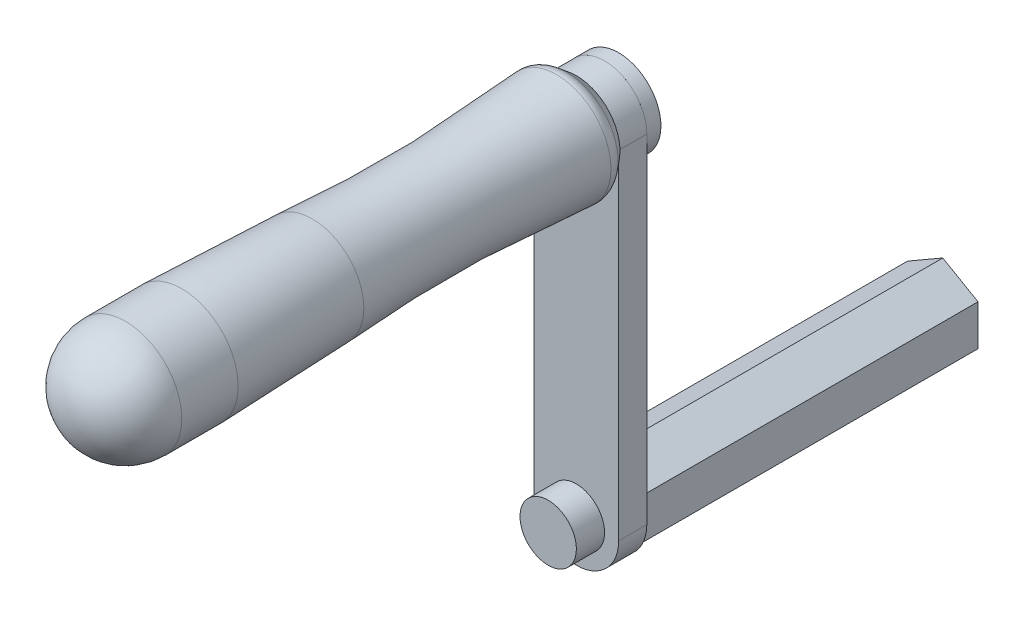
ISO-10303-21;
HEADER;
FILE_DESCRIPTION(('STEP AP214'),'2;1');
FILE_NAME('part.step','',(''),(''),'','','');
FILE_SCHEMA(('AUTOMOTIVE_DESIGN { 1 0 10303 214 1 1 1 1 }'));
ENDSEC;
DATA;
#1=APPLICATION_CONTEXT('core data for automotive mechanical design processes');
#2=APPLICATION_PROTOCOL_DEFINITION('international standard','automotive_design',2000,#1);
#3=PRODUCT_CONTEXT('',#1,'mechanical');
#4=PRODUCT('Part','Part','',(#3));
#5=PRODUCT_RELATED_PRODUCT_CATEGORY('part','',(#4));
#6=PRODUCT_DEFINITION_FORMATION('','',#4);
#7=PRODUCT_DEFINITION_CONTEXT('part definition',#1,'design');
#8=PRODUCT_DEFINITION('design','',#6,#7);
#9=PRODUCT_DEFINITION_SHAPE('','',#8);
#10=(LENGTH_UNIT() NAMED_UNIT(*) SI_UNIT(.MILLI.,.METRE.));
#11=(NAMED_UNIT(*) PLANE_ANGLE_UNIT() SI_UNIT($,.RADIAN.));
#12=(NAMED_UNIT(*) SI_UNIT($,.STERADIAN.) SOLID_ANGLE_UNIT());
#13=UNCERTAINTY_MEASURE_WITH_UNIT(LENGTH_MEASURE(1.E-05),#10,'distance_accuracy_value','');
#14=(GEOMETRIC_REPRESENTATION_CONTEXT(3) GLOBAL_UNCERTAINTY_ASSIGNED_CONTEXT((#13)) GLOBAL_UNIT_ASSIGNED_CONTEXT((#10,
#11,#12)) REPRESENTATION_CONTEXT('',''));
#15=CARTESIAN_POINT('',(0.,0.,0.));
#16=DIRECTION('',(0.,0.,1.));
#17=DIRECTION('',(1.,0.,0.));
#18=AXIS2_PLACEMENT_3D('',#15,#16,#17);
#19=CARTESIAN_POINT('',(-6.66133814775094E-13,76.2000000000005,34.925));
#20=DIRECTION('',(0.,0.,-1.));
#21=DIRECTION('',(0.,1.,0.));
#22=AXIS2_PLACEMENT_3D('',#19,#20,#21);
#23=CYLINDRICAL_SURFACE('',#22,3.175);
#24=CARTESIAN_POINT('',(-6.66133814775094E-13,76.2000000000005,44.45));
#25=DIRECTION('',(0.,0.,-1.));
#26=DIRECTION('',(0.,1.,0.));
#27=AXIS2_PLACEMENT_3D('',#24,#25,#26);
#28=CIRCLE('',#27,3.175);
#29=CARTESIAN_POINT('',(-6.66133814775094E-13,79.3750000000005,44.45));
#30=VERTEX_POINT('',#29);
#31=EDGE_CURVE('E73',#30,#30,#28,.T.);
#32=ORIENTED_EDGE('',*,*,#31,.T.);
#33=EDGE_LOOP('',(#32));
#34=FACE_BOUND('',#33,.T.);
#35=CARTESIAN_POINT('',(-6.66133814775094E-13,76.2000000000005,38.1));
#36=DIRECTION('',(0.,0.,-1.));
#37=DIRECTION('',(0.,1.,0.));
#38=AXIS2_PLACEMENT_3D('',#35,#36,#37);
#39=CIRCLE('',#38,3.175);
#40=CARTESIAN_POINT('',(-6.66133814775094E-13,79.3750000000005,38.1));
#41=VERTEX_POINT('',#40);
#42=EDGE_CURVE('E99',#41,#41,#39,.T.);
#43=ORIENTED_EDGE('',*,*,#42,.F.);
#44=EDGE_LOOP('',(#43));
#45=FACE_BOUND('',#44,.T.);
#46=ADVANCED_FACE('F53',(#34,#45),#23,.T.);
#47=CARTESIAN_POINT('',(-6.66133814775094E-13,88.9000000000006,44.4500000000001));
#48=DIRECTION('',(0.,0.,-1.));
#49=DIRECTION('',(0.,1.,0.));
#50=AXIS2_PLACEMENT_3D('',#47,#48,#49);
#51=PLANE('',#50);
#52=CARTESIAN_POINT('',(-6.66133814775094E-13,76.2000000000005,44.4500000000001));
#53=DIRECTION('',(0.,0.,-1.));
#54=DIRECTION('',(0.,1.,0.));
#55=AXIS2_PLACEMENT_3D('',#52,#53,#54);
#56=CIRCLE('',#55,9.81907710263147);
#57=CARTESIAN_POINT('',(-6.66133814775094E-13,86.019077102632,44.4500000000001));
#58=VERTEX_POINT('',#57);
#59=EDGE_CURVE('E67',#58,#58,#56,.T.);
#60=ORIENTED_EDGE('',*,*,#59,.T.);
#61=EDGE_LOOP('',(#60));
#62=FACE_BOUND('',#61,.T.);
#63=ORIENTED_EDGE('',*,*,#31,.F.);
#64=EDGE_LOOP('',(#63));
#65=FACE_BOUND('',#64,.T.);
#66=ADVANCED_FACE('F109',(#62,#65),#51,.T.);
#67=CARTESIAN_POINT('',(-6.66133814775094E-13,76.2000000000005,80.0843738322252));
#68=DIRECTION('',(0.,0.,-1.));
#69=DIRECTION('',(0.,1.,0.));
#70=AXIS2_PLACEMENT_3D('',#67,#68,#69);
#71=TOROIDAL_SURFACE('',#70,340.971581775799,330.2);
#72=CARTESIAN_POINT('',(-6.66133814775094E-13,76.2000000000005,48.9048527456207));
#73=DIRECTION('',(0.,0.,1.));
#74=DIRECTION('',(0.,-1.,0.));
#75=AXIS2_PLACEMENT_3D('',#72,#73,#74);
#76=CIRCLE('',#75,12.2469592346667);
#77=CARTESIAN_POINT('',(-6.66133814775094E-13,63.9530407653337,48.9048527456207));
#78=VERTEX_POINT('',#77);
#79=EDGE_CURVE('E61',#78,#78,#76,.T.);
#80=ORIENTED_EDGE('',*,*,#79,.T.);
#81=EDGE_LOOP('',(#80));
#82=FACE_BOUND('',#81,.T.);
#83=CARTESIAN_POINT('',(-6.66133814775094E-13,76.2000000000005,103.962068321228));
#84=DIRECTION('',(0.,0.,-1.));
#85=DIRECTION('',(0.,1.,0.));
#86=AXIS2_PLACEMENT_3D('',#83,#84,#85);
#87=CIRCLE('',#86,11.6360451176823);
#88=CARTESIAN_POINT('',(-6.66133814775094E-13,87.8360451176828,103.962068321228));
#89=VERTEX_POINT('',#88);
#90=EDGE_CURVE('E79',#89,#89,#87,.T.);
#91=ORIENTED_EDGE('',*,*,#90,.T.);
#92=EDGE_LOOP('',(#91));
#93=FACE_BOUND('',#92,.T.);
#94=ADVANCED_FACE('F116',(#82,#93),#71,.F.);
#95=CARTESIAN_POINT('',(-6.66133814775094E-13,76.2000000000005,133.35));
#96=DIRECTION('',(0.,0.,-1.));
#97=DIRECTION('',(0.,1.,0.));
#98=AXIS2_PLACEMENT_3D('',#95,#96,#97);
#99=DEGENERATE_TOROIDAL_SURFACE('',#98,393.7,406.4,.F.);
#100=CARTESIAN_POINT('',(-6.66133814775094E-13,76.2000000000005,133.35));
#101=DIRECTION('',(0.,0.,-1.));
#102=DIRECTION('',(0.,1.,0.));
#103=AXIS2_PLACEMENT_3D('',#100,#101,#102);
#104=CIRCLE('',#103,12.7);
#105=CARTESIAN_POINT('',(-6.66133814775094E-13,88.9000000000005,133.35));
#106=VERTEX_POINT('',#105);
#107=EDGE_CURVE('E83',#106,#106,#104,.T.);
#108=ORIENTED_EDGE('',*,*,#107,.T.);
#109=EDGE_LOOP('',(#108));
#110=FACE_BOUND('',#109,.T.);
#111=ORIENTED_EDGE('',*,*,#90,.F.);
#112=EDGE_LOOP('',(#111));
#113=FACE_BOUND('',#112,.T.);
#114=ADVANCED_FACE('F155',(#110,#113),#99,.F.);
#115=CARTESIAN_POINT('',(-6.66133814775094E-13,76.2000000000005,34.925));
#116=DIRECTION('',(0.,0.,-1.));
#117=DIRECTION('',(0.,1.,0.));
#118=AXIS2_PLACEMENT_3D('',#115,#116,#117);
#119=CYLINDRICAL_SURFACE('',#118,12.7);
#120=CARTESIAN_POINT('',(-6.66133814775094E-13,76.2000000000005,146.05));
#121=DIRECTION('',(0.,0.,-1.));
#122=DIRECTION('',(0.,1.,0.));
#123=AXIS2_PLACEMENT_3D('',#120,#121,#122);
#124=CIRCLE('',#123,12.7);
#125=CARTESIAN_POINT('',(-6.66133814775094E-13,88.9000000000005,146.05));
#126=VERTEX_POINT('',#125);
#127=EDGE_CURVE('E87',#126,#126,#124,.T.);
#128=ORIENTED_EDGE('',*,*,#127,.T.);
#129=EDGE_LOOP('',(#128));
#130=FACE_BOUND('',#129,.T.);
#131=ORIENTED_EDGE('',*,*,#107,.F.);
#132=EDGE_LOOP('',(#131));
#133=FACE_BOUND('',#132,.T.);
#134=ADVANCED_FACE('F151',(#130,#133),#119,.T.);
#135=CARTESIAN_POINT('',(-6.66133814775094E-13,76.2000000000005,146.05));
#136=DIRECTION('',(0.,0.,-1.));
#137=DIRECTION('',(0.,1.,0.));
#138=AXIS2_PLACEMENT_3D('',#135,#136,#137);
#139=SPHERICAL_SURFACE('',#138,12.7);
#140=ORIENTED_EDGE('',*,*,#127,.F.);
#141=EDGE_LOOP('',(#140));
#142=FACE_BOUND('',#141,.T.);
#143=ADVANCED_FACE('F147',(#142),#139,.T.);
#144=CARTESIAN_POINT('',(-6.66133814775094E-13,85.7249999999998,34.925));
#145=DIRECTION('',(0.,0.,-1.));
#146=DIRECTION('',(0.,1.,0.));
#147=AXIS2_PLACEMENT_3D('',#144,#145,#146);
#148=PLANE('',#147);
#149=CARTESIAN_POINT('',(-6.66133814775094E-13,76.2000000000005,34.925));
#150=DIRECTION('',(0.,0.,-1.));
#151=DIRECTION('',(0.,1.,0.));
#152=AXIS2_PLACEMENT_3D('',#149,#150,#151);
#153=CIRCLE('',#152,9.52500000000002);
#154=CARTESIAN_POINT('',(-6.66133814775094E-13,85.7250000000005,34.925));
#155=VERTEX_POINT('',#154);
#156=EDGE_CURVE('E91',#155,#155,#153,.T.);
#157=ORIENTED_EDGE('',*,*,#156,.T.);
#158=EDGE_LOOP('',(#157));
#159=FACE_BOUND('',#158,.T.);
#160=ADVANCED_FACE('F141',(#159),#148,.T.);
#161=CARTESIAN_POINT('',(-6.66133814775094E-13,76.2000000000005,34.925));
#162=DIRECTION('',(0.,0.,-1.));
#163=DIRECTION('',(0.,1.,0.));
#164=AXIS2_PLACEMENT_3D('',#161,#162,#163);
#165=CYLINDRICAL_SURFACE('',#164,9.52500000000001);
#166=CARTESIAN_POINT('',(-6.66133814775094E-13,76.2000000000005,38.1));
#167=DIRECTION('',(0.,0.,-1.));
#168=DIRECTION('',(0.,1.,0.));
#169=AXIS2_PLACEMENT_3D('',#166,#167,#168);
#170=CIRCLE('',#169,9.52500000000001);
#171=CARTESIAN_POINT('',(-6.66133814775094E-13,85.7250000000005,38.1));
#172=VERTEX_POINT('',#171);
#173=EDGE_CURVE('E95',#172,#172,#170,.T.);
#174=ORIENTED_EDGE('',*,*,#173,.T.);
#175=EDGE_LOOP('',(#174));
#176=FACE_BOUND('',#175,.T.);
#177=ORIENTED_EDGE('',*,*,#156,.F.);
#178=EDGE_LOOP('',(#177));
#179=FACE_BOUND('',#178,.T.);
#180=ADVANCED_FACE('F131',(#176,#179),#165,.T.);
#181=CARTESIAN_POINT('',(-6.66133814775094E-13,79.375,38.1));
#182=DIRECTION('',(0.,0.,1.));
#183=DIRECTION('',(0.,-1.,0.));
#184=AXIS2_PLACEMENT_3D('',#181,#182,#183);
#185=PLANE('',#184);
#186=ORIENTED_EDGE('',*,*,#42,.T.);
#187=EDGE_LOOP('',(#186));
#188=FACE_BOUND('',#187,.T.);
#189=ORIENTED_EDGE('',*,*,#173,.F.);
#190=EDGE_LOOP('',(#189));
#191=FACE_BOUND('',#190,.T.);
#192=ADVANCED_FACE('F105',(#188,#191),#185,.T.);
#193=CARTESIAN_POINT('',(-6.66133814775094E-13,76.2000000000005,44.4500000000001));
#194=DIRECTION('',(0.,0.,1.));
#195=DIRECTION('',(1.,0.,0.));
#196=AXIS2_PLACEMENT_3D('',#193,#194,#195);
#197=CONICAL_SURFACE('',#196,9.81907710263147,0.677270039999598);
#198=CARTESIAN_POINT('',(-6.66133814775094E-13,76.2000000000005,46.6153789451303));
#199=DIRECTION('',(0.,0.,-1.));
#200=DIRECTION('',(0.,1.,0.));
#201=AXIS2_PLACEMENT_3D('',#198,#199,#200);
#202=CIRCLE('',#201,11.5603798729694);
#203=CARTESIAN_POINT('',(-6.66133814775094E-13,87.7603798729699,46.6153789451303));
#204=VERTEX_POINT('',#203);
#205=EDGE_CURVE('E11',#204,#204,#202,.T.);
#206=ORIENTED_EDGE('',*,*,#205,.T.);
#207=EDGE_LOOP('',(#206));
#208=FACE_BOUND('',#207,.T.);
#209=ORIENTED_EDGE('',*,*,#59,.F.);
#210=EDGE_LOOP('',(#209));
#211=FACE_BOUND('',#210,.T.);
#212=ADVANCED_FACE('F121',(#208,#211),#197,.T.);
#213=CARTESIAN_POINT('',(-6.66133814775094E-13,76.2000000000005,48.6050496582495));
#214=DIRECTION('',(0.,0.,-1.));
#215=DIRECTION('',(0.,1.,0.));
#216=AXIS2_PLACEMENT_3D('',#213,#214,#215);
#217=TOROIDAL_SURFACE('',#216,9.08614555638663,3.175);
#218=ORIENTED_EDGE('',*,*,#205,.F.);
#219=EDGE_LOOP('',(#218));
#220=FACE_BOUND('',#219,.T.);
#221=ORIENTED_EDGE('',*,*,#79,.F.);
#222=EDGE_LOOP('',(#221));
#223=FACE_BOUND('',#222,.T.);
#224=ADVANCED_FACE('F55',(#220,#223),#217,.T.);
#225=CLOSED_SHELL('',(#46,#66,#94,#114,#134,#143,#160,#180,#192,#212,#224));
#226=MANIFOLD_SOLID_BREP('B2',#225);
#227=CARTESIAN_POINT('',(9.52499999999934,6.66133814775094E-13,-59.0363217339426));
#228=DIRECTION('',(1.,0.,0.));
#229=DIRECTION('',(0.,1.,0.));
#230=AXIS2_PLACEMENT_3D('',#227,#228,#229);
#231=PLANE('',#230);
#232=DIRECTION('',(0.,-1.,0.));
#233=VECTOR('',#232,1.);
#234=CARTESIAN_POINT('',(9.52499999999934,6.66133814775094E-13,38.1));
#235=LINE('',#234,#233);
#236=CARTESIAN_POINT('',(9.52499999999934,76.2,38.1));
#237=VERTEX_POINT('',#236);
#238=CARTESIAN_POINT('',(9.52499999999934,6.66133814775094E-13,38.1));
#239=VERTEX_POINT('',#238);
#240=EDGE_CURVE('E323',#237,#239,#235,.T.);
#241=ORIENTED_EDGE('',*,*,#240,.F.);
#242=DIRECTION('',(0.,0.,1.));
#243=VECTOR('',#242,1.);
#244=CARTESIAN_POINT('',(9.52499999999934,76.2,-59.0363217339426));
#245=LINE('',#244,#243);
#246=CARTESIAN_POINT('',(9.52499999999934,76.2,44.45));
#247=VERTEX_POINT('',#246);
#248=EDGE_CURVE('E271',#237,#247,#245,.T.);
#249=ORIENTED_EDGE('',*,*,#248,.T.);
#250=DIRECTION('',(0.,1.,0.));
#251=VECTOR('',#250,1.);
#252=CARTESIAN_POINT('',(9.52499999999934,6.66133814775094E-13,44.45));
#253=LINE('',#252,#251);
#254=CARTESIAN_POINT('',(9.52499999999934,6.66133814775094E-13,44.45));
#255=VERTEX_POINT('',#254);
#256=EDGE_CURVE('E274',#255,#247,#253,.T.);
#257=ORIENTED_EDGE('',*,*,#256,.F.);
#258=DIRECTION('',(0.,0.,1.));
#259=VECTOR('',#258,1.);
#260=CARTESIAN_POINT('',(9.52499999999934,6.66133814775094E-13,-59.0363217339426));
#261=LINE('',#260,#259);
#262=EDGE_CURVE('E262',#239,#255,#261,.T.);
#263=ORIENTED_EDGE('',*,*,#262,.F.);
#264=EDGE_LOOP('',(#241,#249,#257,#263));
#265=FACE_BOUND('',#264,.T.);
#266=ADVANCED_FACE('F223',(#265),#231,.T.);
#267=CARTESIAN_POINT('',(-6.66133814775094E-13,76.2000000000005,-59.0363217339426));
#268=DIRECTION('',(0.,0.,1.));
#269=DIRECTION('',(1.,0.,0.));
#270=AXIS2_PLACEMENT_3D('',#267,#268,#269);
#271=CYLINDRICAL_SURFACE('',#270,9.52500000000001);
#272=CARTESIAN_POINT('',(-6.66133814775094E-13,76.2000000000005,38.1));
#273=DIRECTION('',(0.,0.,1.));
#274=DIRECTION('',(1.,0.,0.));
#275=AXIS2_PLACEMENT_3D('',#272,#273,#274);
#276=CIRCLE('',#275,9.52500000000001);
#277=CARTESIAN_POINT('',(-9.52500000000001,76.2,38.1));
#278=VERTEX_POINT('',#277);
#279=EDGE_CURVE('E301',#278,#237,#276,.F.);
#280=ORIENTED_EDGE('',*,*,#279,.F.);
#281=DIRECTION('',(0.,0.,1.));
#282=VECTOR('',#281,1.);
#283=CARTESIAN_POINT('',(-9.52500000000001,76.2,-59.0363217339426));
#284=LINE('',#283,#282);
#285=CARTESIAN_POINT('',(-9.52500000000001,76.2,44.45));
#286=VERTEX_POINT('',#285);
#287=EDGE_CURVE('E302',#278,#286,#284,.T.);
#288=ORIENTED_EDGE('',*,*,#287,.T.);
#289=CARTESIAN_POINT('',(-6.66133814775094E-13,76.2000000000005,44.45));
#290=DIRECTION('',(0.,0.,1.));
#291=DIRECTION('',(1.,0.,0.));
#292=AXIS2_PLACEMENT_3D('',#289,#290,#291);
#293=CIRCLE('',#292,9.52500000000001);
#294=EDGE_CURVE('E280',#247,#286,#293,.T.);
#295=ORIENTED_EDGE('',*,*,#294,.F.);
#296=ORIENTED_EDGE('',*,*,#248,.F.);
#297=EDGE_LOOP('',(#280,#288,#295,#296));
#298=FACE_BOUND('',#297,.T.);
#299=ADVANCED_FACE('F359',(#298),#271,.T.);
#300=CARTESIAN_POINT('',(-9.52500000000067,0.,-59.0363217339426));
#301=DIRECTION('',(-1.,0.,0.));
#302=DIRECTION('',(0.,-1.,0.));
#303=AXIS2_PLACEMENT_3D('',#300,#301,#302);
#304=PLANE('',#303);
#305=DIRECTION('',(0.,1.,0.));
#306=VECTOR('',#305,1.);
#307=CARTESIAN_POINT('',(-9.52500000000067,0.,38.1));
#308=LINE('',#307,#306);
#309=CARTESIAN_POINT('',(-9.52500000000067,0.,38.1));
#310=VERTEX_POINT('',#309);
#311=EDGE_CURVE('E316',#310,#278,#308,.T.);
#312=ORIENTED_EDGE('',*,*,#311,.F.);
#313=DIRECTION('',(0.,0.,1.));
#314=VECTOR('',#313,1.);
#315=CARTESIAN_POINT('',(-9.52500000000067,0.,-59.0363217339426));
#316=LINE('',#315,#314);
#317=CARTESIAN_POINT('',(-9.52500000000067,0.,44.45));
#318=VERTEX_POINT('',#317);
#319=EDGE_CURVE('E298',#310,#318,#316,.T.);
#320=ORIENTED_EDGE('',*,*,#319,.T.);
#321=DIRECTION('',(0.,-1.,0.));
#322=VECTOR('',#321,1.);
#323=CARTESIAN_POINT('',(-9.52500000000067,0.,44.45));
#324=LINE('',#323,#322);
#325=EDGE_CURVE('E272',#286,#318,#324,.T.);
#326=ORIENTED_EDGE('',*,*,#325,.F.);
#327=ORIENTED_EDGE('',*,*,#287,.F.);
#328=EDGE_LOOP('',(#312,#320,#326,#327));
#329=FACE_BOUND('',#328,.T.);
#330=ADVANCED_FACE('F364',(#329),#304,.T.);
#331=CARTESIAN_POINT('',(0.,0.,-59.0363217339426));
#332=DIRECTION('',(0.,0.,1.));
#333=DIRECTION('',(1.,0.,0.));
#334=AXIS2_PLACEMENT_3D('',#331,#332,#333);
#335=CYLINDRICAL_SURFACE('',#334,9.52500000000001);
#336=CARTESIAN_POINT('',(0.,0.,38.1));
#337=DIRECTION('',(0.,0.,1.));
#338=DIRECTION('',(1.,0.,0.));
#339=AXIS2_PLACEMENT_3D('',#336,#337,#338);
#340=CIRCLE('',#339,9.52500000000001);
#341=EDGE_CURVE('E242',#239,#310,#340,.F.);
#342=ORIENTED_EDGE('',*,*,#341,.F.);
#343=ORIENTED_EDGE('',*,*,#262,.T.);
#344=CARTESIAN_POINT('',(0.,0.,44.45));
#345=DIRECTION('',(0.,0.,1.));
#346=DIRECTION('',(1.,0.,0.));
#347=AXIS2_PLACEMENT_3D('',#344,#345,#346);
#348=CIRCLE('',#347,9.52500000000001);
#349=EDGE_CURVE('E266',#318,#255,#348,.T.);
#350=ORIENTED_EDGE('',*,*,#349,.F.);
#351=ORIENTED_EDGE('',*,*,#319,.F.);
#352=EDGE_LOOP('',(#342,#343,#350,#351));
#353=FACE_BOUND('',#352,.T.);
#354=ADVANCED_FACE('F225',(#353),#335,.T.);
#355=CARTESIAN_POINT('',(0.,0.,-59.0363217339426));
#356=DIRECTION('',(0.,0.,1.));
#357=DIRECTION('',(1.,0.,0.));
#358=AXIS2_PLACEMENT_3D('',#355,#356,#357);
#359=CYLINDRICAL_SURFACE('',#358,3.175);
#360=CARTESIAN_POINT('',(0.,0.,38.1));
#361=DIRECTION('',(0.,0.,1.));
#362=DIRECTION('',(1.,0.,0.));
#363=AXIS2_PLACEMENT_3D('',#360,#361,#362);
#364=CIRCLE('',#363,3.175);
#365=CARTESIAN_POINT('',(3.175,0.,38.1));
#366=VERTEX_POINT('',#365);
#367=EDGE_CURVE('E51',#366,#366,#364,.F.);
#368=ORIENTED_EDGE('',*,*,#367,.T.);
#369=EDGE_LOOP('',(#368));
#370=FACE_BOUND('',#369,.T.);
#371=CARTESIAN_POINT('',(0.,0.,44.45));
#372=DIRECTION('',(0.,0.,1.));
#373=DIRECTION('',(1.,0.,0.));
#374=AXIS2_PLACEMENT_3D('',#371,#372,#373);
#375=CIRCLE('',#374,3.175);
#376=CARTESIAN_POINT('',(3.175,0.,44.45));
#377=VERTEX_POINT('',#376);
#378=EDGE_CURVE('E285',#377,#377,#375,.T.);
#379=ORIENTED_EDGE('',*,*,#378,.T.);
#380=EDGE_LOOP('',(#379));
#381=FACE_BOUND('',#380,.T.);
#382=ADVANCED_FACE('F342',(#370,#381),#359,.F.);
#383=CARTESIAN_POINT('',(0.,0.,44.45));
#384=DIRECTION('',(0.,0.,1.));
#385=DIRECTION('',(1.,0.,0.));
#386=AXIS2_PLACEMENT_3D('',#383,#384,#385);
#387=PLANE('',#386);
#388=CARTESIAN_POINT('',(-6.66133814775094E-13,76.2000000000005,44.45));
#389=DIRECTION('',(0.,0.,1.));
#390=DIRECTION('',(1.,0.,0.));
#391=AXIS2_PLACEMENT_3D('',#388,#389,#390);
#392=CIRCLE('',#391,3.175);
#393=CARTESIAN_POINT('',(3.17499999999933,76.2000000000005,44.45));
#394=VERTEX_POINT('',#393);
#395=EDGE_CURVE('E290',#394,#394,#392,.T.);
#396=ORIENTED_EDGE('',*,*,#395,.F.);
#397=EDGE_LOOP('',(#396));
#398=FACE_BOUND('',#397,.T.);
#399=ORIENTED_EDGE('',*,*,#378,.F.);
#400=EDGE_LOOP('',(#399));
#401=FACE_BOUND('',#400,.T.);
#402=ORIENTED_EDGE('',*,*,#349,.T.);
#403=ORIENTED_EDGE('',*,*,#256,.T.);
#404=ORIENTED_EDGE('',*,*,#294,.T.);
#405=ORIENTED_EDGE('',*,*,#325,.T.);
#406=EDGE_LOOP('',(#402,#403,#404,#405));
#407=FACE_BOUND('',#406,.T.);
#408=ADVANCED_FACE('F282',(#398,#401,#407),#387,.T.);
#409=CARTESIAN_POINT('',(-6.66133814775094E-13,76.2000000000005,-59.0363217339426));
#410=DIRECTION('',(0.,0.,1.));
#411=DIRECTION('',(1.,0.,0.));
#412=AXIS2_PLACEMENT_3D('',#409,#410,#411);
#413=CYLINDRICAL_SURFACE('',#412,3.175);
#414=CARTESIAN_POINT('',(-6.66133814775094E-13,76.2000000000005,38.1));
#415=DIRECTION('',(0.,0.,1.));
#416=DIRECTION('',(1.,0.,0.));
#417=AXIS2_PLACEMENT_3D('',#414,#415,#416);
#418=CIRCLE('',#417,3.175);
#419=CARTESIAN_POINT('',(3.17499999999933,76.2000000000005,38.1));
#420=VERTEX_POINT('',#419);
#421=EDGE_CURVE('E227',#420,#420,#418,.F.);
#422=ORIENTED_EDGE('',*,*,#421,.T.);
#423=EDGE_LOOP('',(#422));
#424=FACE_BOUND('',#423,.T.);
#425=ORIENTED_EDGE('',*,*,#395,.T.);
#426=EDGE_LOOP('',(#425));
#427=FACE_BOUND('',#426,.T.);
#428=ADVANCED_FACE('F333',(#424,#427),#413,.F.);
#429=CARTESIAN_POINT('',(0.,0.,38.1));
#430=DIRECTION('',(0.,0.,1.));
#431=DIRECTION('',(1.,0.,0.));
#432=AXIS2_PLACEMENT_3D('',#429,#430,#431);
#433=PLANE('',#432);
#434=ORIENTED_EDGE('',*,*,#341,.T.);
#435=ORIENTED_EDGE('',*,*,#311,.T.);
#436=ORIENTED_EDGE('',*,*,#279,.T.);
#437=ORIENTED_EDGE('',*,*,#240,.T.);
#438=EDGE_LOOP('',(#434,#435,#436,#437));
#439=FACE_BOUND('',#438,.T.);
#440=ORIENTED_EDGE('',*,*,#421,.F.);
#441=EDGE_LOOP('',(#440));
#442=FACE_BOUND('',#441,.T.);
#443=ORIENTED_EDGE('',*,*,#367,.F.);
#444=EDGE_LOOP('',(#443));
#445=FACE_BOUND('',#444,.T.);
#446=ADVANCED_FACE('F336',(#439,#442,#445),#433,.F.);
#447=CLOSED_SHELL('',(#266,#299,#330,#354,#382,#408,#428,#446));
#448=MANIFOLD_SOLID_BREP('B6',#447);
#449=CARTESIAN_POINT('',(0.,0.,50.8));
#450=DIRECTION('',(0.,0.,-1.));
#451=DIRECTION('',(-1.,0.,0.));
#452=AXIS2_PLACEMENT_3D('',#449,#450,#451);
#453=CYLINDRICAL_SURFACE('',#452,3.175);
#454=CARTESIAN_POINT('',(0.,0.,38.1));
#455=DIRECTION('',(0.,0.,1.));
#456=DIRECTION('',(1.,0.,0.));
#457=AXIS2_PLACEMENT_3D('',#454,#455,#456);
#458=CIRCLE('',#457,3.175);
#459=CARTESIAN_POINT('',(3.175,0.,38.1));
#460=VERTEX_POINT('',#459);
#461=EDGE_CURVE('E414',#460,#460,#458,.T.);
#462=ORIENTED_EDGE('',*,*,#461,.T.);
#463=EDGE_LOOP('',(#462));
#464=FACE_BOUND('',#463,.T.);
#465=CARTESIAN_POINT('',(0.,0.,44.45));
#466=DIRECTION('',(0.,0.,1.));
#467=DIRECTION('',(1.,0.,0.));
#468=AXIS2_PLACEMENT_3D('',#465,#466,#467);
#469=CIRCLE('',#468,3.175);
#470=CARTESIAN_POINT('',(3.175,0.,44.45));
#471=VERTEX_POINT('',#470);
#472=EDGE_CURVE('E221',#471,#471,#469,.T.);
#473=ORIENTED_EDGE('',*,*,#472,.F.);
#474=EDGE_LOOP('',(#473));
#475=FACE_BOUND('',#474,.T.);
#476=ADVANCED_FACE('F404',(#464,#475),#453,.T.);
#477=CARTESIAN_POINT('',(7.93749999999926,4.58271776169328,38.1));
#478=DIRECTION('',(-0.499999999999999,-0.866025403784439,0.));
#479=DIRECTION('',(0.866025403784439,-0.5,0.));
#480=AXIS2_PLACEMENT_3D('',#477,#478,#479);
#481=PLANE('',#480);
#482=DIRECTION('',(-0.866025403784439,0.499999999999999,0.));
#483=VECTOR('',#482,1.);
#484=CARTESIAN_POINT('',(7.93749999999926,4.58271776169328,-38.1));
#485=LINE('',#484,#483);
#486=CARTESIAN_POINT('',(7.93749999999926,4.58271776169328,-38.1));
#487=VERTEX_POINT('',#486);
#488=CARTESIAN_POINT('',(0.,9.16543552338545,-38.1));
#489=VERTEX_POINT('',#488);
#490=EDGE_CURVE('E496',#487,#489,#485,.T.);
#491=ORIENTED_EDGE('',*,*,#490,.T.);
#492=DIRECTION('',(0.,0.,-1.));
#493=VECTOR('',#492,1.);
#494=CARTESIAN_POINT('',(0.,9.16543552338545,38.1));
#495=LINE('',#494,#493);
#496=CARTESIAN_POINT('',(0.,9.16543552338545,38.1));
#497=VERTEX_POINT('',#496);
#498=EDGE_CURVE('E523',#497,#489,#495,.T.);
#499=ORIENTED_EDGE('',*,*,#498,.F.);
#500=DIRECTION('',(-0.866025403784439,0.499999999999999,0.));
#501=VECTOR('',#500,1.);
#502=CARTESIAN_POINT('',(7.93749999999926,4.58271776169328,38.1));
#503=LINE('',#502,#501);
#504=CARTESIAN_POINT('',(7.93749999999926,4.58271776169328,38.1));
#505=VERTEX_POINT('',#504);
#506=EDGE_CURVE('E513',#505,#497,#503,.T.);
#507=ORIENTED_EDGE('',*,*,#506,.F.);
#508=DIRECTION('',(0.,0.,-1.));
#509=VECTOR('',#508,1.);
#510=CARTESIAN_POINT('',(7.93749999999926,4.58271776169328,38.1));
#511=LINE('',#510,#509);
#512=EDGE_CURVE('E492',#505,#487,#511,.T.);
#513=ORIENTED_EDGE('',*,*,#512,.T.);
#514=EDGE_LOOP('',(#491,#499,#507,#513));
#515=FACE_BOUND('',#514,.T.);
#516=ADVANCED_FACE('F406',(#515),#481,.F.);
#517=CARTESIAN_POINT('',(0.,9.16543552338545,38.1));
#518=DIRECTION('',(0.5,-0.866025403784439,0.));
#519=DIRECTION('',(0.866025403784439,0.5,0.));
#520=AXIS2_PLACEMENT_3D('',#517,#518,#519);
#521=PLANE('',#520);
#522=DIRECTION('',(-0.866025403784439,-0.5,0.));
#523=VECTOR('',#522,1.);
#524=CARTESIAN_POINT('',(0.,9.16543552338545,-38.1));
#525=LINE('',#524,#523);
#526=CARTESIAN_POINT('',(-7.9375000000006,4.58271776169328,-38.1));
#527=VERTEX_POINT('',#526);
#528=EDGE_CURVE('E500',#489,#527,#525,.T.);
#529=ORIENTED_EDGE('',*,*,#528,.T.);
#530=DIRECTION('',(0.,0.,-1.));
#531=VECTOR('',#530,1.);
#532=CARTESIAN_POINT('',(-7.9375000000006,4.58271776169328,38.1));
#533=LINE('',#532,#531);
#534=CARTESIAN_POINT('',(-7.9375000000006,4.58271776169328,38.1));
#535=VERTEX_POINT('',#534);
#536=EDGE_CURVE('E520',#535,#527,#533,.T.);
#537=ORIENTED_EDGE('',*,*,#536,.F.);
#538=DIRECTION('',(-0.866025403784439,-0.5,0.));
#539=VECTOR('',#538,1.);
#540=CARTESIAN_POINT('',(0.,9.16543552338545,38.1));
#541=LINE('',#540,#539);
#542=EDGE_CURVE('E460',#497,#535,#541,.T.);
#543=ORIENTED_EDGE('',*,*,#542,.F.);
#544=ORIENTED_EDGE('',*,*,#498,.T.);
#545=EDGE_LOOP('',(#529,#537,#543,#544));
#546=FACE_BOUND('',#545,.T.);
#547=ADVANCED_FACE('F583',(#546),#521,.F.);
#548=CARTESIAN_POINT('',(-7.9375000000006,4.58271776169328,38.1));
#549=DIRECTION('',(1.,0.,0.));
#550=DIRECTION('',(0.,1.,0.));
#551=AXIS2_PLACEMENT_3D('',#548,#549,#550);
#552=PLANE('',#551);
#553=DIRECTION('',(0.,-1.,0.));
#554=VECTOR('',#553,1.);
#555=CARTESIAN_POINT('',(-7.9375000000006,4.58271776169328,-38.1));
#556=LINE('',#555,#554);
#557=CARTESIAN_POINT('',(-7.93749999999993,-4.58271776169261,-38.1));
#558=VERTEX_POINT('',#557);
#559=EDGE_CURVE('E504',#527,#558,#556,.T.);
#560=ORIENTED_EDGE('',*,*,#559,.T.);
#561=DIRECTION('',(0.,0.,-1.));
#562=VECTOR('',#561,1.);
#563=CARTESIAN_POINT('',(-7.93749999999993,-4.58271776169261,38.1));
#564=LINE('',#563,#562);
#565=CARTESIAN_POINT('',(-7.93749999999993,-4.58271776169261,38.1));
#566=VERTEX_POINT('',#565);
#567=EDGE_CURVE('E484',#566,#558,#564,.T.);
#568=ORIENTED_EDGE('',*,*,#567,.F.);
#569=DIRECTION('',(0.,-1.,0.));
#570=VECTOR('',#569,1.);
#571=CARTESIAN_POINT('',(-7.9375000000006,4.58271776169328,38.1));
#572=LINE('',#571,#570);
#573=EDGE_CURVE('E473',#535,#566,#572,.T.);
#574=ORIENTED_EDGE('',*,*,#573,.F.);
#575=ORIENTED_EDGE('',*,*,#536,.T.);
#576=EDGE_LOOP('',(#560,#568,#574,#575));
#577=FACE_BOUND('',#576,.T.);
#578=ADVANCED_FACE('F597',(#577),#552,.F.);
#579=CARTESIAN_POINT('',(-7.93749999999993,-4.58271776169261,38.1));
#580=DIRECTION('',(0.5,0.866025403784439,0.));
#581=DIRECTION('',(-0.866025403784439,0.5,0.));
#582=AXIS2_PLACEMENT_3D('',#579,#580,#581);
#583=PLANE('',#582);
#584=DIRECTION('',(0.866025403784439,-0.5,0.));
#585=VECTOR('',#584,1.);
#586=CARTESIAN_POINT('',(-7.93749999999993,-4.58271776169261,-38.1));
#587=LINE('',#586,#585);
#588=CARTESIAN_POINT('',(-4.44089209850063E-13,-9.16543552338478,-38.1));
#589=VERTEX_POINT('',#588);
#590=EDGE_CURVE('E482',#558,#589,#587,.T.);
#591=ORIENTED_EDGE('',*,*,#590,.T.);
#592=DIRECTION('',(0.,0.,-1.));
#593=VECTOR('',#592,1.);
#594=CARTESIAN_POINT('',(-4.44089209850063E-13,-9.16543552338478,38.1));
#595=LINE('',#594,#593);
#596=CARTESIAN_POINT('',(-4.44089209850063E-13,-9.16543552338478,38.1));
#597=VERTEX_POINT('',#596);
#598=EDGE_CURVE('E479',#597,#589,#595,.T.);
#599=ORIENTED_EDGE('',*,*,#598,.F.);
#600=DIRECTION('',(0.866025403784439,-0.5,0.));
#601=VECTOR('',#600,1.);
#602=CARTESIAN_POINT('',(-7.93749999999993,-4.58271776169261,38.1));
#603=LINE('',#602,#601);
#604=EDGE_CURVE('E467',#566,#597,#603,.T.);
#605=ORIENTED_EDGE('',*,*,#604,.F.);
#606=ORIENTED_EDGE('',*,*,#567,.T.);
#607=EDGE_LOOP('',(#591,#599,#605,#606));
#608=FACE_BOUND('',#607,.T.);
#609=ADVANCED_FACE('F480',(#608),#583,.F.);
#610=CARTESIAN_POINT('',(-4.44089209850063E-13,-9.16543552338478,38.1));
#611=DIRECTION('',(-0.5,0.866025403784439,0.));
#612=DIRECTION('',(-0.866025403784439,-0.5,0.));
#613=AXIS2_PLACEMENT_3D('',#610,#611,#612);
#614=PLANE('',#613);
#615=DIRECTION('',(0.866025403784439,0.5,0.));
#616=VECTOR('',#615,1.);
#617=CARTESIAN_POINT('',(-4.44089209850063E-13,-9.16543552338478,-38.1));
#618=LINE('',#617,#616);
#619=CARTESIAN_POINT('',(7.93749999999926,-4.58271776169261,-38.1));
#620=VERTEX_POINT('',#619);
#621=EDGE_CURVE('E445',#589,#620,#618,.T.);
#622=ORIENTED_EDGE('',*,*,#621,.T.);
#623=DIRECTION('',(0.,0.,-1.));
#624=VECTOR('',#623,1.);
#625=CARTESIAN_POINT('',(7.93749999999926,-4.58271776169261,38.1));
#626=LINE('',#625,#624);
#627=CARTESIAN_POINT('',(7.93749999999926,-4.58271776169261,38.1));
#628=VERTEX_POINT('',#627);
#629=EDGE_CURVE('E485',#628,#620,#626,.T.);
#630=ORIENTED_EDGE('',*,*,#629,.F.);
#631=DIRECTION('',(0.866025403784439,0.5,0.));
#632=VECTOR('',#631,1.);
#633=CARTESIAN_POINT('',(-4.44089209850063E-13,-9.16543552338478,38.1));
#634=LINE('',#633,#632);
#635=EDGE_CURVE('E471',#597,#628,#634,.T.);
#636=ORIENTED_EDGE('',*,*,#635,.F.);
#637=ORIENTED_EDGE('',*,*,#598,.T.);
#638=EDGE_LOOP('',(#622,#630,#636,#637));
#639=FACE_BOUND('',#638,.T.);
#640=ADVANCED_FACE('F487',(#639),#614,.F.);
#641=CARTESIAN_POINT('',(7.93749999999926,-4.58271776169261,38.1));
#642=DIRECTION('',(-1.,0.,0.));
#643=DIRECTION('',(0.,-1.,0.));
#644=AXIS2_PLACEMENT_3D('',#641,#642,#643);
#645=PLANE('',#644);
#646=DIRECTION('',(0.,1.,0.));
#647=VECTOR('',#646,1.);
#648=CARTESIAN_POINT('',(7.93749999999926,-4.58271776169261,-38.1));
#649=LINE('',#648,#647);
#650=EDGE_CURVE('E451',#620,#487,#649,.T.);
#651=ORIENTED_EDGE('',*,*,#650,.T.);
#652=ORIENTED_EDGE('',*,*,#512,.F.);
#653=DIRECTION('',(0.,1.,0.));
#654=VECTOR('',#653,1.);
#655=CARTESIAN_POINT('',(7.93749999999926,-4.58271776169261,38.1));
#656=LINE('',#655,#654);
#657=EDGE_CURVE('E422',#628,#505,#656,.T.);
#658=ORIENTED_EDGE('',*,*,#657,.F.);
#659=ORIENTED_EDGE('',*,*,#629,.T.);
#660=EDGE_LOOP('',(#651,#652,#658,#659));
#661=FACE_BOUND('',#660,.T.);
#662=ADVANCED_FACE('F588',(#661),#645,.F.);
#663=CARTESIAN_POINT('',(0.,0.,38.1));
#664=DIRECTION('',(0.,0.,1.));
#665=DIRECTION('',(1.,0.,0.));
#666=AXIS2_PLACEMENT_3D('',#663,#664,#665);
#667=PLANE('',#666);
#668=ORIENTED_EDGE('',*,*,#461,.F.);
#669=EDGE_LOOP('',(#668));
#670=FACE_BOUND('',#669,.T.);
#671=ORIENTED_EDGE('',*,*,#506,.T.);
#672=ORIENTED_EDGE('',*,*,#542,.T.);
#673=ORIENTED_EDGE('',*,*,#573,.T.);
#674=ORIENTED_EDGE('',*,*,#604,.T.);
#675=ORIENTED_EDGE('',*,*,#635,.T.);
#676=ORIENTED_EDGE('',*,*,#657,.T.);
#677=EDGE_LOOP('',(#671,#672,#673,#674,#675,#676));
#678=FACE_BOUND('',#677,.T.);
#679=ADVANCED_FACE('F469',(#670,#678),#667,.T.);
#680=CARTESIAN_POINT('',(0.,0.,-38.1));
#681=DIRECTION('',(0.,0.,1.));
#682=DIRECTION('',(1.,0.,0.));
#683=AXIS2_PLACEMENT_3D('',#680,#681,#682);
#684=PLANE('',#683);
#685=ORIENTED_EDGE('',*,*,#490,.F.);
#686=ORIENTED_EDGE('',*,*,#650,.F.);
#687=ORIENTED_EDGE('',*,*,#621,.F.);
#688=ORIENTED_EDGE('',*,*,#590,.F.);
#689=ORIENTED_EDGE('',*,*,#559,.F.);
#690=ORIENTED_EDGE('',*,*,#528,.F.);
#691=EDGE_LOOP('',(#685,#686,#687,#688,#689,#690));
#692=FACE_BOUND('',#691,.T.);
#693=ADVANCED_FACE('F564',(#692),#684,.F.);
#694=CARTESIAN_POINT('',(0.,0.,44.45));
#695=DIRECTION('',(0.,0.,1.));
#696=DIRECTION('',(1.,0.,0.));
#697=AXIS2_PLACEMENT_3D('',#694,#695,#696);
#698=CYLINDRICAL_SURFACE('',#697,6.35);
#699=CARTESIAN_POINT('',(0.,0.,44.45));
#700=DIRECTION('',(0.,0.,1.));
#701=DIRECTION('',(1.,0.,0.));
#702=AXIS2_PLACEMENT_3D('',#699,#700,#701);
#703=CIRCLE('',#702,6.35);
#704=CARTESIAN_POINT('',(6.35,0.,44.45));
#705=VERTEX_POINT('',#704);
#706=EDGE_CURVE('E501',#705,#705,#703,.T.);
#707=ORIENTED_EDGE('',*,*,#706,.T.);
#708=EDGE_LOOP('',(#707));
#709=FACE_BOUND('',#708,.T.);
#710=CARTESIAN_POINT('',(0.,0.,50.8));
#711=DIRECTION('',(0.,0.,1.));
#712=DIRECTION('',(1.,0.,0.));
#713=AXIS2_PLACEMENT_3D('',#710,#711,#712);
#714=CIRCLE('',#713,6.35);
#715=CARTESIAN_POINT('',(6.35,0.,50.8));
#716=VERTEX_POINT('',#715);
#717=EDGE_CURVE('E535',#716,#716,#714,.T.);
#718=ORIENTED_EDGE('',*,*,#717,.F.);
#719=EDGE_LOOP('',(#718));
#720=FACE_BOUND('',#719,.T.);
#721=ADVANCED_FACE('F561',(#709,#720),#698,.T.);
#722=CARTESIAN_POINT('',(0.,0.,44.45));
#723=DIRECTION('',(0.,0.,1.));
#724=DIRECTION('',(1.,0.,0.));
#725=AXIS2_PLACEMENT_3D('',#722,#723,#724);
#726=PLANE('',#725);
#727=ORIENTED_EDGE('',*,*,#472,.T.);
#728=EDGE_LOOP('',(#727));
#729=FACE_BOUND('',#728,.T.);
#730=ORIENTED_EDGE('',*,*,#706,.F.);
#731=EDGE_LOOP('',(#730));
#732=FACE_BOUND('',#731,.T.);
#733=ADVANCED_FACE('F563',(#729,#732),#726,.F.);
#734=CARTESIAN_POINT('',(0.,0.,50.8));
#735=DIRECTION('',(0.,0.,1.));
#736=DIRECTION('',(1.,0.,0.));
#737=AXIS2_PLACEMENT_3D('',#734,#735,#736);
#738=PLANE('',#737);
#739=ORIENTED_EDGE('',*,*,#717,.T.);
#740=EDGE_LOOP('',(#739));
#741=FACE_BOUND('',#740,.T.);
#742=ADVANCED_FACE('F559',(#741),#738,.T.);
#743=CLOSED_SHELL('',(#476,#516,#547,#578,#609,#640,#662,#679,#693,#721,#733,#742));
#744=MANIFOLD_SOLID_BREP('B45',#743);
#745=ADVANCED_BREP_SHAPE_REPRESENTATION('',(#18,#226,#448,#744),#14);
#746=SHAPE_DEFINITION_REPRESENTATION(#9,#745);
ENDSEC;
END-ISO-10303-21;
